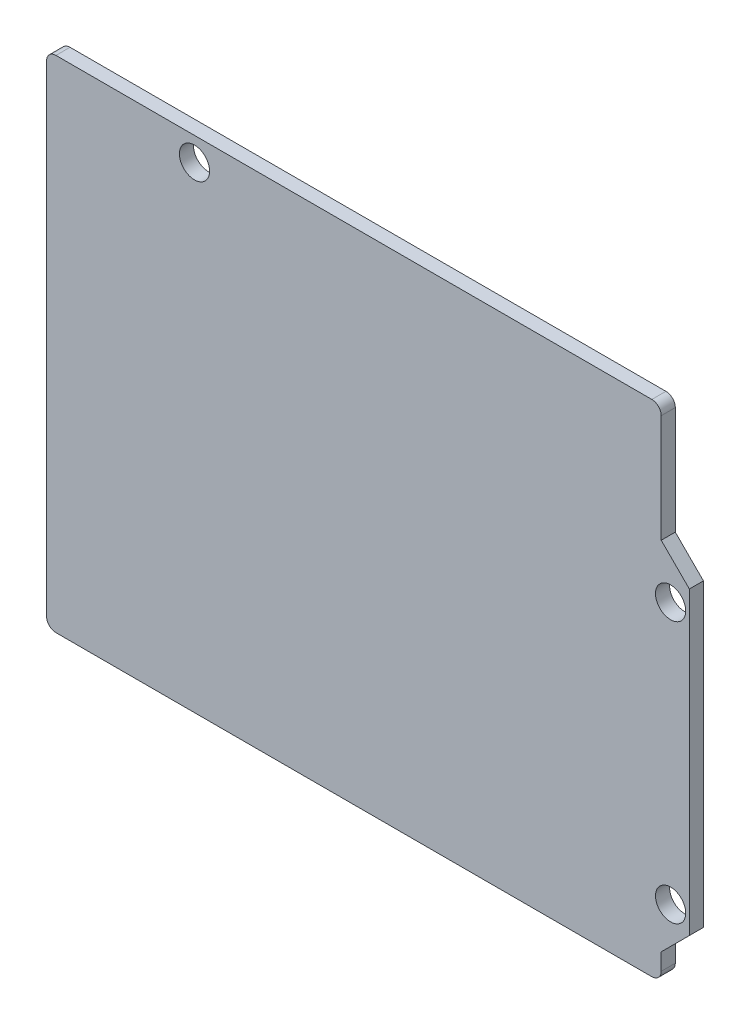
ISO-10303-21;
HEADER;
FILE_DESCRIPTION(('STEP AP214'),'2;1');
FILE_NAME('part.step','',(''),(''),'','','');
FILE_SCHEMA(('AUTOMOTIVE_DESIGN { 1 0 10303 214 1 1 1 1 }'));
ENDSEC;
DATA;
#1=APPLICATION_CONTEXT('core data for automotive mechanical design processes');
#2=APPLICATION_PROTOCOL_DEFINITION('international standard','automotive_design',2000,#1);
#3=PRODUCT_CONTEXT('',#1,'mechanical');
#4=PRODUCT('Part','Part','',(#3));
#5=PRODUCT_RELATED_PRODUCT_CATEGORY('part','',(#4));
#6=PRODUCT_DEFINITION_FORMATION('','',#4);
#7=PRODUCT_DEFINITION_CONTEXT('part definition',#1,'design');
#8=PRODUCT_DEFINITION('design','',#6,#7);
#9=PRODUCT_DEFINITION_SHAPE('','',#8);
#10=(LENGTH_UNIT() NAMED_UNIT(*) SI_UNIT(.MILLI.,.METRE.));
#11=(NAMED_UNIT(*) PLANE_ANGLE_UNIT() SI_UNIT($,.RADIAN.));
#12=(NAMED_UNIT(*) SI_UNIT($,.STERADIAN.) SOLID_ANGLE_UNIT());
#13=UNCERTAINTY_MEASURE_WITH_UNIT(LENGTH_MEASURE(1.E-05),#10,'distance_accuracy_value','');
#14=(GEOMETRIC_REPRESENTATION_CONTEXT(3) GLOBAL_UNCERTAINTY_ASSIGNED_CONTEXT((#13)) GLOBAL_UNIT_ASSIGNED_CONTEXT((#10,
#11,#12)) REPRESENTATION_CONTEXT('',''));
#15=CARTESIAN_POINT('',(0.,0.,0.));
#16=DIRECTION('',(0.,0.,1.));
#17=DIRECTION('',(1.,0.,0.));
#18=AXIS2_PLACEMENT_3D('',#15,#16,#17);
#19=CARTESIAN_POINT('',(-33.265,-25.65,1.5));
#20=DIRECTION('',(0.,0.,1.));
#21=DIRECTION('',(1.,0.,0.));
#22=AXIS2_PLACEMENT_3D('',#19,#20,#21);
#23=PLANE('',#22);
#24=CARTESIAN_POINT('',(32.265,-18.98,1.5));
#25=DIRECTION('',(0.,0.,1.));
#26=DIRECTION('',(1.,0.,0.));
#27=AXIS2_PLACEMENT_3D('',#24,#25,#26);
#28=CIRCLE('',#27,1.61);
#29=CARTESIAN_POINT('',(33.875,-18.98,1.5));
#30=VERTEX_POINT('',#29);
#31=EDGE_CURVE('E287',#30,#30,#28,.T.);
#32=ORIENTED_EDGE('',*,*,#31,.F.);
#33=EDGE_LOOP('',(#32));
#34=FACE_BOUND('',#33,.T.);
#35=CARTESIAN_POINT('',(-33.265,-25.65,1.5));
#36=DIRECTION('',(0.,0.,1.));
#37=DIRECTION('',(1.,0.,0.));
#38=AXIS2_PLACEMENT_3D('',#35,#36,#37);
#39=CIRCLE('',#38,0.999999999999997);
#40=CARTESIAN_POINT('',(-34.265,-25.65,1.5));
#41=VERTEX_POINT('',#40);
#42=CARTESIAN_POINT('',(-33.265,-26.65,1.5));
#43=VERTEX_POINT('',#42);
#44=EDGE_CURVE('E178',#41,#43,#39,.T.);
#45=ORIENTED_EDGE('',*,*,#44,.T.);
#46=DIRECTION('',(1.,0.,0.));
#47=VECTOR('',#46,1.);
#48=CARTESIAN_POINT('',(-33.265,-26.65,1.5));
#49=LINE('',#48,#47);
#50=CARTESIAN_POINT('',(30.265,-26.65,1.5));
#51=VERTEX_POINT('',#50);
#52=EDGE_CURVE('E106',#43,#51,#49,.T.);
#53=ORIENTED_EDGE('',*,*,#52,.T.);
#54=CARTESIAN_POINT('',(30.265,-25.65,1.5));
#55=DIRECTION('',(0.,0.,1.));
#56=DIRECTION('',(-1.,0.,0.));
#57=AXIS2_PLACEMENT_3D('',#54,#55,#56);
#58=CIRCLE('',#57,1.);
#59=CARTESIAN_POINT('',(31.265,-25.65,1.5));
#60=VERTEX_POINT('',#59);
#61=EDGE_CURVE('E205',#51,#60,#58,.T.);
#62=ORIENTED_EDGE('',*,*,#61,.T.);
#63=DIRECTION('',(0.,1.,0.));
#64=VECTOR('',#63,1.);
#65=CARTESIAN_POINT('',(31.265,-23.85,1.5));
#66=LINE('',#65,#64);
#67=CARTESIAN_POINT('',(31.265,-23.85,1.5));
#68=VERTEX_POINT('',#67);
#69=EDGE_CURVE('E224',#60,#68,#66,.T.);
#70=ORIENTED_EDGE('',*,*,#69,.T.);
#71=DIRECTION('',(0.707106781186549,0.707106781186546,0.));
#72=VECTOR('',#71,1.);
#73=CARTESIAN_POINT('',(34.265,-20.85,1.5));
#74=LINE('',#73,#72);
#75=CARTESIAN_POINT('',(34.265,-20.85,1.5));
#76=VERTEX_POINT('',#75);
#77=EDGE_CURVE('E221',#68,#76,#74,.T.);
#78=ORIENTED_EDGE('',*,*,#77,.T.);
#79=DIRECTION('',(0.,1.,0.));
#80=VECTOR('',#79,1.);
#81=CARTESIAN_POINT('',(34.265,11.15,1.5));
#82=LINE('',#81,#80);
#83=CARTESIAN_POINT('',(34.265,11.15,1.5));
#84=VERTEX_POINT('',#83);
#85=EDGE_CURVE('E223',#76,#84,#82,.T.);
#86=ORIENTED_EDGE('',*,*,#85,.T.);
#87=DIRECTION('',(-0.707106781186549,0.707106781186546,0.));
#88=VECTOR('',#87,1.);
#89=CARTESIAN_POINT('',(31.265,14.15,1.5));
#90=LINE('',#89,#88);
#91=CARTESIAN_POINT('',(31.265,14.15,1.5));
#92=VERTEX_POINT('',#91);
#93=EDGE_CURVE('E226',#84,#92,#90,.T.);
#94=ORIENTED_EDGE('',*,*,#93,.T.);
#95=DIRECTION('',(0.,1.,0.));
#96=VECTOR('',#95,1.);
#97=CARTESIAN_POINT('',(31.265,25.65,1.5));
#98=LINE('',#97,#96);
#99=CARTESIAN_POINT('',(31.265,25.65,1.5));
#100=VERTEX_POINT('',#99);
#101=EDGE_CURVE('E232',#92,#100,#98,.T.);
#102=ORIENTED_EDGE('',*,*,#101,.T.);
#103=CARTESIAN_POINT('',(30.265,25.65,1.5));
#104=DIRECTION('',(0.,0.,1.));
#105=DIRECTION('',(1.,0.,0.));
#106=AXIS2_PLACEMENT_3D('',#103,#104,#105);
#107=CIRCLE('',#106,1.);
#108=CARTESIAN_POINT('',(30.265,26.65,1.5));
#109=VERTEX_POINT('',#108);
#110=EDGE_CURVE('E137',#100,#109,#107,.T.);
#111=ORIENTED_EDGE('',*,*,#110,.T.);
#112=DIRECTION('',(-1.,0.,0.));
#113=VECTOR('',#112,1.);
#114=CARTESIAN_POINT('',(-33.265,26.65,1.5));
#115=LINE('',#114,#113);
#116=CARTESIAN_POINT('',(-33.265,26.65,1.5));
#117=VERTEX_POINT('',#116);
#118=EDGE_CURVE('E131',#109,#117,#115,.T.);
#119=ORIENTED_EDGE('',*,*,#118,.T.);
#120=CARTESIAN_POINT('',(-33.265,25.65,1.5));
#121=DIRECTION('',(0.,0.,1.));
#122=DIRECTION('',(1.,0.,0.));
#123=AXIS2_PLACEMENT_3D('',#120,#121,#122);
#124=CIRCLE('',#123,0.999999999999997);
#125=CARTESIAN_POINT('',(-34.265,25.65,1.5));
#126=VERTEX_POINT('',#125);
#127=EDGE_CURVE('E135',#117,#126,#124,.T.);
#128=ORIENTED_EDGE('',*,*,#127,.T.);
#129=DIRECTION('',(0.,-1.,0.));
#130=VECTOR('',#129,1.);
#131=CARTESIAN_POINT('',(-34.265,25.65,1.5));
#132=LINE('',#131,#130);
#133=EDGE_CURVE('E51',#126,#41,#132,.T.);
#134=ORIENTED_EDGE('',*,*,#133,.T.);
#135=EDGE_LOOP('',(#45,#53,#62,#70,#78,#86,#94,#102,#111,#119,#128,#134));
#136=FACE_BOUND('',#135,.T.);
#137=CARTESIAN_POINT('',(32.265,8.92,1.5));
#138=DIRECTION('',(0.,0.,1.));
#139=DIRECTION('',(1.,0.,0.));
#140=AXIS2_PLACEMENT_3D('',#137,#138,#139);
#141=CIRCLE('',#140,1.61);
#142=CARTESIAN_POINT('',(33.875,8.92,1.5));
#143=VERTEX_POINT('',#142);
#144=EDGE_CURVE('E159',#143,#143,#141,.T.);
#145=ORIENTED_EDGE('',*,*,#144,.F.);
#146=EDGE_LOOP('',(#145));
#147=FACE_BOUND('',#146,.T.);
#148=CARTESIAN_POINT('',(-18.495,24.15,1.5));
#149=DIRECTION('',(0.,0.,1.));
#150=DIRECTION('',(1.,0.,0.));
#151=AXIS2_PLACEMENT_3D('',#148,#149,#150);
#152=CIRCLE('',#151,1.61);
#153=CARTESIAN_POINT('',(-16.885,24.15,1.5));
#154=VERTEX_POINT('',#153);
#155=EDGE_CURVE('E278',#154,#154,#152,.T.);
#156=ORIENTED_EDGE('',*,*,#155,.F.);
#157=EDGE_LOOP('',(#156));
#158=FACE_BOUND('',#157,.T.);
#159=ADVANCED_FACE('F34',(#34,#136,#147,#158),#23,.T.);
#160=CARTESIAN_POINT('',(-33.265,-25.65,0.));
#161=DIRECTION('',(0.,0.,1.));
#162=DIRECTION('',(1.,0.,0.));
#163=AXIS2_PLACEMENT_3D('',#160,#161,#162);
#164=PLANE('',#163);
#165=CARTESIAN_POINT('',(-33.265,-25.65,0.));
#166=DIRECTION('',(0.,0.,1.));
#167=DIRECTION('',(1.,0.,0.));
#168=AXIS2_PLACEMENT_3D('',#165,#166,#167);
#169=CIRCLE('',#168,0.999999999999997);
#170=CARTESIAN_POINT('',(-34.265,-25.65,0.));
#171=VERTEX_POINT('',#170);
#172=CARTESIAN_POINT('',(-33.265,-26.65,0.));
#173=VERTEX_POINT('',#172);
#174=EDGE_CURVE('E155',#171,#173,#169,.T.);
#175=ORIENTED_EDGE('',*,*,#174,.F.);
#176=DIRECTION('',(0.,-1.,0.));
#177=VECTOR('',#176,1.);
#178=CARTESIAN_POINT('',(-34.265,25.65,0.));
#179=LINE('',#178,#177);
#180=CARTESIAN_POINT('',(-34.265,25.65,0.));
#181=VERTEX_POINT('',#180);
#182=EDGE_CURVE('E98',#181,#171,#179,.T.);
#183=ORIENTED_EDGE('',*,*,#182,.F.);
#184=CARTESIAN_POINT('',(-33.265,25.65,0.));
#185=DIRECTION('',(0.,0.,1.));
#186=DIRECTION('',(1.,0.,0.));
#187=AXIS2_PLACEMENT_3D('',#184,#185,#186);
#188=CIRCLE('',#187,0.999999999999997);
#189=CARTESIAN_POINT('',(-33.265,26.65,0.));
#190=VERTEX_POINT('',#189);
#191=EDGE_CURVE('E92',#190,#181,#188,.T.);
#192=ORIENTED_EDGE('',*,*,#191,.F.);
#193=DIRECTION('',(-1.,0.,0.));
#194=VECTOR('',#193,1.);
#195=CARTESIAN_POINT('',(-33.265,26.65,0.));
#196=LINE('',#195,#194);
#197=CARTESIAN_POINT('',(30.265,26.65,0.));
#198=VERTEX_POINT('',#197);
#199=EDGE_CURVE('E145',#198,#190,#196,.T.);
#200=ORIENTED_EDGE('',*,*,#199,.F.);
#201=CARTESIAN_POINT('',(30.265,25.65,0.));
#202=DIRECTION('',(0.,0.,1.));
#203=DIRECTION('',(1.,0.,0.));
#204=AXIS2_PLACEMENT_3D('',#201,#202,#203);
#205=CIRCLE('',#204,1.);
#206=CARTESIAN_POINT('',(31.265,25.65,0.));
#207=VERTEX_POINT('',#206);
#208=EDGE_CURVE('E173',#207,#198,#205,.T.);
#209=ORIENTED_EDGE('',*,*,#208,.F.);
#210=DIRECTION('',(0.,1.,0.));
#211=VECTOR('',#210,1.);
#212=CARTESIAN_POINT('',(31.265,25.65,0.));
#213=LINE('',#212,#211);
#214=CARTESIAN_POINT('',(31.265,14.15,0.));
#215=VERTEX_POINT('',#214);
#216=EDGE_CURVE('E171',#215,#207,#213,.T.);
#217=ORIENTED_EDGE('',*,*,#216,.F.);
#218=DIRECTION('',(-0.707106781186549,0.707106781186546,0.));
#219=VECTOR('',#218,1.);
#220=CARTESIAN_POINT('',(31.265,14.15,0.));
#221=LINE('',#220,#219);
#222=CARTESIAN_POINT('',(34.265,11.15,0.));
#223=VERTEX_POINT('',#222);
#224=EDGE_CURVE('E169',#223,#215,#221,.T.);
#225=ORIENTED_EDGE('',*,*,#224,.F.);
#226=DIRECTION('',(0.,1.,0.));
#227=VECTOR('',#226,1.);
#228=CARTESIAN_POINT('',(34.265,11.15,0.));
#229=LINE('',#228,#227);
#230=CARTESIAN_POINT('',(34.265,-20.85,0.));
#231=VERTEX_POINT('',#230);
#232=EDGE_CURVE('E167',#231,#223,#229,.T.);
#233=ORIENTED_EDGE('',*,*,#232,.F.);
#234=DIRECTION('',(0.707106781186549,0.707106781186546,0.));
#235=VECTOR('',#234,1.);
#236=CARTESIAN_POINT('',(34.265,-20.85,0.));
#237=LINE('',#236,#235);
#238=CARTESIAN_POINT('',(31.265,-23.85,0.));
#239=VERTEX_POINT('',#238);
#240=EDGE_CURVE('E165',#239,#231,#237,.T.);
#241=ORIENTED_EDGE('',*,*,#240,.F.);
#242=DIRECTION('',(0.,1.,0.));
#243=VECTOR('',#242,1.);
#244=CARTESIAN_POINT('',(31.265,-23.85,0.));
#245=LINE('',#244,#243);
#246=CARTESIAN_POINT('',(31.265,-25.65,0.));
#247=VERTEX_POINT('',#246);
#248=EDGE_CURVE('E163',#247,#239,#245,.T.);
#249=ORIENTED_EDGE('',*,*,#248,.F.);
#250=CARTESIAN_POINT('',(30.265,-25.65,0.));
#251=DIRECTION('',(0.,0.,1.));
#252=DIRECTION('',(-1.,0.,0.));
#253=AXIS2_PLACEMENT_3D('',#250,#251,#252);
#254=CIRCLE('',#253,1.);
#255=CARTESIAN_POINT('',(30.265,-26.65,0.));
#256=VERTEX_POINT('',#255);
#257=EDGE_CURVE('E161',#256,#247,#254,.T.);
#258=ORIENTED_EDGE('',*,*,#257,.F.);
#259=DIRECTION('',(1.,0.,0.));
#260=VECTOR('',#259,1.);
#261=CARTESIAN_POINT('',(-33.265,-26.65,0.));
#262=LINE('',#261,#260);
#263=EDGE_CURVE('E158',#173,#256,#262,.T.);
#264=ORIENTED_EDGE('',*,*,#263,.F.);
#265=EDGE_LOOP('',(#175,#183,#192,#200,#209,#217,#225,#233,#241,#249,#258,#264));
#266=FACE_BOUND('',#265,.T.);
#267=CARTESIAN_POINT('',(32.265,8.92,0.));
#268=DIRECTION('',(0.,0.,1.));
#269=DIRECTION('',(1.,0.,0.));
#270=AXIS2_PLACEMENT_3D('',#267,#268,#269);
#271=CIRCLE('',#270,1.61);
#272=CARTESIAN_POINT('',(33.875,8.92,0.));
#273=VERTEX_POINT('',#272);
#274=EDGE_CURVE('E290',#273,#273,#271,.T.);
#275=ORIENTED_EDGE('',*,*,#274,.T.);
#276=EDGE_LOOP('',(#275));
#277=FACE_BOUND('',#276,.T.);
#278=CARTESIAN_POINT('',(32.265,-18.98,0.));
#279=DIRECTION('',(0.,0.,1.));
#280=DIRECTION('',(1.,0.,0.));
#281=AXIS2_PLACEMENT_3D('',#278,#279,#280);
#282=CIRCLE('',#281,1.61);
#283=CARTESIAN_POINT('',(33.875,-18.98,0.));
#284=VERTEX_POINT('',#283);
#285=EDGE_CURVE('E284',#284,#284,#282,.T.);
#286=ORIENTED_EDGE('',*,*,#285,.T.);
#287=EDGE_LOOP('',(#286));
#288=FACE_BOUND('',#287,.T.);
#289=CARTESIAN_POINT('',(-18.495,24.15,0.));
#290=DIRECTION('',(0.,0.,1.));
#291=DIRECTION('',(1.,0.,0.));
#292=AXIS2_PLACEMENT_3D('',#289,#290,#291);
#293=CIRCLE('',#292,1.61);
#294=CARTESIAN_POINT('',(-16.885,24.15,0.));
#295=VERTEX_POINT('',#294);
#296=EDGE_CURVE('E281',#295,#295,#293,.T.);
#297=ORIENTED_EDGE('',*,*,#296,.T.);
#298=EDGE_LOOP('',(#297));
#299=FACE_BOUND('',#298,.T.);
#300=ADVANCED_FACE('F209',(#266,#277,#288,#299),#164,.F.);
#301=CARTESIAN_POINT('',(-33.265,-25.65,1.5));
#302=DIRECTION('',(0.,0.,-1.));
#303=DIRECTION('',(-1.,0.,0.));
#304=AXIS2_PLACEMENT_3D('',#301,#302,#303);
#305=CYLINDRICAL_SURFACE('',#304,0.999999999999997);
#306=ORIENTED_EDGE('',*,*,#174,.T.);
#307=DIRECTION('',(0.,0.,-1.));
#308=VECTOR('',#307,1.);
#309=CARTESIAN_POINT('',(-33.265,-26.65,1.5));
#310=LINE('',#309,#308);
#311=EDGE_CURVE('E11',#43,#173,#310,.T.);
#312=ORIENTED_EDGE('',*,*,#311,.F.);
#313=ORIENTED_EDGE('',*,*,#44,.F.);
#314=DIRECTION('',(0.,0.,-1.));
#315=VECTOR('',#314,1.);
#316=CARTESIAN_POINT('',(-34.265,-25.65,1.5));
#317=LINE('',#316,#315);
#318=EDGE_CURVE('E151',#41,#171,#317,.T.);
#319=ORIENTED_EDGE('',*,*,#318,.T.);
#320=EDGE_LOOP('',(#306,#312,#313,#319));
#321=FACE_BOUND('',#320,.T.);
#322=ADVANCED_FACE('F36',(#321),#305,.T.);
#323=CARTESIAN_POINT('',(-33.265,-26.65,1.5));
#324=DIRECTION('',(0.,1.,0.));
#325=DIRECTION('',(-1.,0.,0.));
#326=AXIS2_PLACEMENT_3D('',#323,#324,#325);
#327=PLANE('',#326);
#328=ORIENTED_EDGE('',*,*,#263,.T.);
#329=DIRECTION('',(0.,0.,-1.));
#330=VECTOR('',#329,1.);
#331=CARTESIAN_POINT('',(30.265,-26.65,1.5));
#332=LINE('',#331,#330);
#333=EDGE_CURVE('E43',#51,#256,#332,.T.);
#334=ORIENTED_EDGE('',*,*,#333,.F.);
#335=ORIENTED_EDGE('',*,*,#52,.F.);
#336=ORIENTED_EDGE('',*,*,#311,.T.);
#337=EDGE_LOOP('',(#328,#334,#335,#336));
#338=FACE_BOUND('',#337,.T.);
#339=ADVANCED_FACE('F392',(#338),#327,.F.);
#340=CARTESIAN_POINT('',(30.265,-25.65,1.5));
#341=DIRECTION('',(0.,0.,-1.));
#342=DIRECTION('',(-1.,0.,0.));
#343=AXIS2_PLACEMENT_3D('',#340,#341,#342);
#344=CYLINDRICAL_SURFACE('',#343,1.);
#345=ORIENTED_EDGE('',*,*,#257,.T.);
#346=DIRECTION('',(0.,0.,-1.));
#347=VECTOR('',#346,1.);
#348=CARTESIAN_POINT('',(31.265,-25.65,1.5));
#349=LINE('',#348,#347);
#350=EDGE_CURVE('E197',#60,#247,#349,.T.);
#351=ORIENTED_EDGE('',*,*,#350,.F.);
#352=ORIENTED_EDGE('',*,*,#61,.F.);
#353=ORIENTED_EDGE('',*,*,#333,.T.);
#354=EDGE_LOOP('',(#345,#351,#352,#353));
#355=FACE_BOUND('',#354,.T.);
#356=ADVANCED_FACE('F203',(#355),#344,.T.);
#357=CARTESIAN_POINT('',(31.265,-23.85,1.5));
#358=DIRECTION('',(-1.,0.,0.));
#359=DIRECTION('',(0.,-1.,0.));
#360=AXIS2_PLACEMENT_3D('',#357,#358,#359);
#361=PLANE('',#360);
#362=ORIENTED_EDGE('',*,*,#248,.T.);
#363=DIRECTION('',(0.,0.,-1.));
#364=VECTOR('',#363,1.);
#365=CARTESIAN_POINT('',(31.265,-23.85,1.5));
#366=LINE('',#365,#364);
#367=EDGE_CURVE('E194',#68,#239,#366,.T.);
#368=ORIENTED_EDGE('',*,*,#367,.F.);
#369=ORIENTED_EDGE('',*,*,#69,.F.);
#370=ORIENTED_EDGE('',*,*,#350,.T.);
#371=EDGE_LOOP('',(#362,#368,#369,#370));
#372=FACE_BOUND('',#371,.T.);
#373=ADVANCED_FACE('F215',(#372),#361,.F.);
#374=CARTESIAN_POINT('',(34.265,-20.85,1.5));
#375=DIRECTION('',(-0.707106781186546,0.707106781186549,0.));
#376=DIRECTION('',(-0.707106781186549,-0.707106781186546,0.));
#377=AXIS2_PLACEMENT_3D('',#374,#375,#376);
#378=PLANE('',#377);
#379=ORIENTED_EDGE('',*,*,#240,.T.);
#380=DIRECTION('',(0.,0.,-1.));
#381=VECTOR('',#380,1.);
#382=CARTESIAN_POINT('',(34.265,-20.85,1.5));
#383=LINE('',#382,#381);
#384=EDGE_CURVE('E191',#76,#231,#383,.T.);
#385=ORIENTED_EDGE('',*,*,#384,.F.);
#386=ORIENTED_EDGE('',*,*,#77,.F.);
#387=ORIENTED_EDGE('',*,*,#367,.T.);
#388=EDGE_LOOP('',(#379,#385,#386,#387));
#389=FACE_BOUND('',#388,.T.);
#390=ADVANCED_FACE('F219',(#389),#378,.F.);
#391=CARTESIAN_POINT('',(34.265,11.15,1.5));
#392=DIRECTION('',(-1.,0.,0.));
#393=DIRECTION('',(0.,-1.,0.));
#394=AXIS2_PLACEMENT_3D('',#391,#392,#393);
#395=PLANE('',#394);
#396=ORIENTED_EDGE('',*,*,#232,.T.);
#397=DIRECTION('',(0.,0.,-1.));
#398=VECTOR('',#397,1.);
#399=CARTESIAN_POINT('',(34.265,11.15,1.5));
#400=LINE('',#399,#398);
#401=EDGE_CURVE('E188',#84,#223,#400,.T.);
#402=ORIENTED_EDGE('',*,*,#401,.F.);
#403=ORIENTED_EDGE('',*,*,#85,.F.);
#404=ORIENTED_EDGE('',*,*,#384,.T.);
#405=EDGE_LOOP('',(#396,#402,#403,#404));
#406=FACE_BOUND('',#405,.T.);
#407=ADVANCED_FACE('F357',(#406),#395,.F.);
#408=CARTESIAN_POINT('',(31.265,14.15,1.5));
#409=DIRECTION('',(-0.707106781186546,-0.707106781186549,0.));
#410=DIRECTION('',(0.707106781186549,-0.707106781186546,0.));
#411=AXIS2_PLACEMENT_3D('',#408,#409,#410);
#412=PLANE('',#411);
#413=ORIENTED_EDGE('',*,*,#224,.T.);
#414=DIRECTION('',(0.,0.,-1.));
#415=VECTOR('',#414,1.);
#416=CARTESIAN_POINT('',(31.265,14.15,1.5));
#417=LINE('',#416,#415);
#418=EDGE_CURVE('E185',#92,#215,#417,.T.);
#419=ORIENTED_EDGE('',*,*,#418,.F.);
#420=ORIENTED_EDGE('',*,*,#93,.F.);
#421=ORIENTED_EDGE('',*,*,#401,.T.);
#422=EDGE_LOOP('',(#413,#419,#420,#421));
#423=FACE_BOUND('',#422,.T.);
#424=ADVANCED_FACE('F348',(#423),#412,.F.);
#425=CARTESIAN_POINT('',(31.265,25.65,1.5));
#426=DIRECTION('',(-1.,0.,0.));
#427=DIRECTION('',(0.,0.,1.));
#428=AXIS2_PLACEMENT_3D('',#425,#426,#427);
#429=PLANE('',#428);
#430=ORIENTED_EDGE('',*,*,#216,.T.);
#431=DIRECTION('',(0.,0.,-1.));
#432=VECTOR('',#431,1.);
#433=CARTESIAN_POINT('',(31.265,25.65,1.5));
#434=LINE('',#433,#432);
#435=EDGE_CURVE('E182',#100,#207,#434,.T.);
#436=ORIENTED_EDGE('',*,*,#435,.F.);
#437=ORIENTED_EDGE('',*,*,#101,.F.);
#438=ORIENTED_EDGE('',*,*,#418,.T.);
#439=EDGE_LOOP('',(#430,#436,#437,#438));
#440=FACE_BOUND('',#439,.T.);
#441=ADVANCED_FACE('F238',(#440),#429,.F.);
#442=CARTESIAN_POINT('',(30.265,25.65,1.5));
#443=DIRECTION('',(0.,0.,-1.));
#444=DIRECTION('',(-1.,0.,0.));
#445=AXIS2_PLACEMENT_3D('',#442,#443,#444);
#446=CYLINDRICAL_SURFACE('',#445,1.);
#447=ORIENTED_EDGE('',*,*,#208,.T.);
#448=DIRECTION('',(0.,0.,-1.));
#449=VECTOR('',#448,1.);
#450=CARTESIAN_POINT('',(30.265,26.65,1.5));
#451=LINE('',#450,#449);
#452=EDGE_CURVE('E146',#109,#198,#451,.T.);
#453=ORIENTED_EDGE('',*,*,#452,.F.);
#454=ORIENTED_EDGE('',*,*,#110,.F.);
#455=ORIENTED_EDGE('',*,*,#435,.T.);
#456=EDGE_LOOP('',(#447,#453,#454,#455));
#457=FACE_BOUND('',#456,.T.);
#458=ADVANCED_FACE('F242',(#457),#446,.T.);
#459=CARTESIAN_POINT('',(-33.265,26.65,1.5));
#460=DIRECTION('',(0.,-1.,0.));
#461=DIRECTION('',(1.,0.,0.));
#462=AXIS2_PLACEMENT_3D('',#459,#460,#461);
#463=PLANE('',#462);
#464=ORIENTED_EDGE('',*,*,#199,.T.);
#465=DIRECTION('',(0.,0.,-1.));
#466=VECTOR('',#465,1.);
#467=CARTESIAN_POINT('',(-33.265,26.65,1.5));
#468=LINE('',#467,#466);
#469=EDGE_CURVE('E142',#117,#190,#468,.T.);
#470=ORIENTED_EDGE('',*,*,#469,.F.);
#471=ORIENTED_EDGE('',*,*,#118,.F.);
#472=ORIENTED_EDGE('',*,*,#452,.T.);
#473=EDGE_LOOP('',(#464,#470,#471,#472));
#474=FACE_BOUND('',#473,.T.);
#475=ADVANCED_FACE('F143',(#474),#463,.F.);
#476=CARTESIAN_POINT('',(-33.265,25.65,1.5));
#477=DIRECTION('',(0.,0.,-1.));
#478=DIRECTION('',(-1.,0.,0.));
#479=AXIS2_PLACEMENT_3D('',#476,#477,#478);
#480=CYLINDRICAL_SURFACE('',#479,0.999999999999997);
#481=ORIENTED_EDGE('',*,*,#191,.T.);
#482=DIRECTION('',(0.,0.,-1.));
#483=VECTOR('',#482,1.);
#484=CARTESIAN_POINT('',(-34.265,25.65,1.5));
#485=LINE('',#484,#483);
#486=EDGE_CURVE('E147',#126,#181,#485,.T.);
#487=ORIENTED_EDGE('',*,*,#486,.F.);
#488=ORIENTED_EDGE('',*,*,#127,.F.);
#489=ORIENTED_EDGE('',*,*,#469,.T.);
#490=EDGE_LOOP('',(#481,#487,#488,#489));
#491=FACE_BOUND('',#490,.T.);
#492=ADVANCED_FACE('F149',(#491),#480,.T.);
#493=CARTESIAN_POINT('',(-34.265,25.65,1.5));
#494=DIRECTION('',(1.,0.,0.));
#495=DIRECTION('',(0.,0.,-1.));
#496=AXIS2_PLACEMENT_3D('',#493,#494,#495);
#497=PLANE('',#496);
#498=ORIENTED_EDGE('',*,*,#182,.T.);
#499=ORIENTED_EDGE('',*,*,#318,.F.);
#500=ORIENTED_EDGE('',*,*,#133,.F.);
#501=ORIENTED_EDGE('',*,*,#486,.T.);
#502=EDGE_LOOP('',(#498,#499,#500,#501));
#503=FACE_BOUND('',#502,.T.);
#504=ADVANCED_FACE('F246',(#503),#497,.F.);
#505=CARTESIAN_POINT('',(32.265,8.92,1.5));
#506=DIRECTION('',(0.,0.,-1.));
#507=DIRECTION('',(-1.,0.,0.));
#508=AXIS2_PLACEMENT_3D('',#505,#506,#507);
#509=CYLINDRICAL_SURFACE('',#508,1.61);
#510=ORIENTED_EDGE('',*,*,#144,.T.);
#511=EDGE_LOOP('',(#510));
#512=FACE_BOUND('',#511,.T.);
#513=ORIENTED_EDGE('',*,*,#274,.F.);
#514=EDGE_LOOP('',(#513));
#515=FACE_BOUND('',#514,.T.);
#516=ADVANCED_FACE('F248',(#512,#515),#509,.F.);
#517=CARTESIAN_POINT('',(32.265,-18.98,1.5));
#518=DIRECTION('',(0.,0.,-1.));
#519=DIRECTION('',(-1.,0.,0.));
#520=AXIS2_PLACEMENT_3D('',#517,#518,#519);
#521=CYLINDRICAL_SURFACE('',#520,1.61);
#522=ORIENTED_EDGE('',*,*,#31,.T.);
#523=EDGE_LOOP('',(#522));
#524=FACE_BOUND('',#523,.T.);
#525=ORIENTED_EDGE('',*,*,#285,.F.);
#526=EDGE_LOOP('',(#525));
#527=FACE_BOUND('',#526,.T.);
#528=ADVANCED_FACE('F254',(#524,#527),#521,.F.);
#529=CARTESIAN_POINT('',(-18.495,24.15,1.5));
#530=DIRECTION('',(0.,0.,-1.));
#531=DIRECTION('',(-1.,0.,0.));
#532=AXIS2_PLACEMENT_3D('',#529,#530,#531);
#533=CYLINDRICAL_SURFACE('',#532,1.61);
#534=ORIENTED_EDGE('',*,*,#155,.T.);
#535=EDGE_LOOP('',(#534));
#536=FACE_BOUND('',#535,.T.);
#537=ORIENTED_EDGE('',*,*,#296,.F.);
#538=EDGE_LOOP('',(#537));
#539=FACE_BOUND('',#538,.T.);
#540=ADVANCED_FACE('F269',(#536,#539),#533,.F.);
#541=CLOSED_SHELL('',(#159,#300,#322,#339,#356,#373,#390,#407,#424,#441,#458,#475,#492,#504,
#516,#528,#540));
#542=MANIFOLD_SOLID_BREP('B2',#541);
#543=ADVANCED_BREP_SHAPE_REPRESENTATION('',(#18,#542),#14);
#544=SHAPE_DEFINITION_REPRESENTATION(#9,#543);
ENDSEC;
END-ISO-10303-21;
